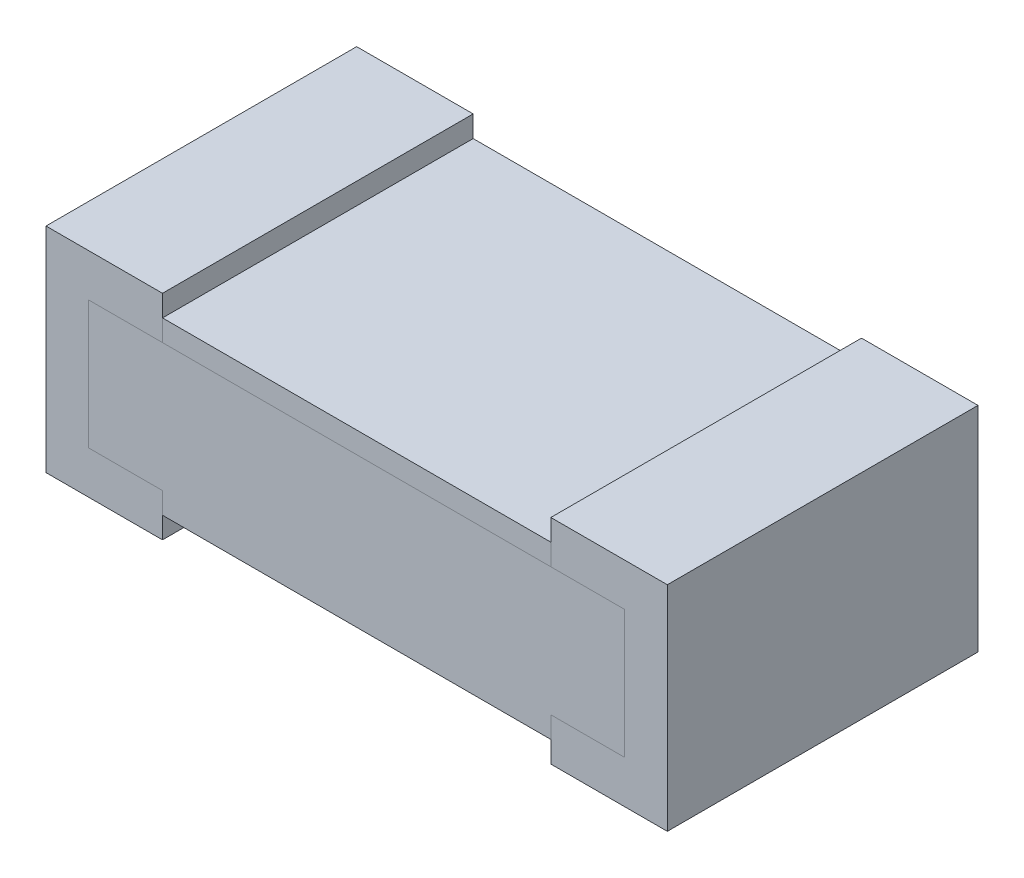
ISO-10303-21;
HEADER;
FILE_DESCRIPTION(('STEP AP214'),'2;1');
FILE_NAME('part.step','',(''),(''),'','','');
FILE_SCHEMA(('AUTOMOTIVE_DESIGN { 1 0 10303 214 1 1 1 1 }'));
ENDSEC;
DATA;
#1=APPLICATION_CONTEXT('core data for automotive mechanical design processes');
#2=APPLICATION_PROTOCOL_DEFINITION('international standard','automotive_design',2000,#1);
#3=PRODUCT_CONTEXT('',#1,'mechanical');
#4=PRODUCT('Part','Part','',(#3));
#5=PRODUCT_RELATED_PRODUCT_CATEGORY('part','',(#4));
#6=PRODUCT_DEFINITION_FORMATION('','',#4);
#7=PRODUCT_DEFINITION_CONTEXT('part definition',#1,'design');
#8=PRODUCT_DEFINITION('design','',#6,#7);
#9=PRODUCT_DEFINITION_SHAPE('','',#8);
#10=(LENGTH_UNIT() NAMED_UNIT(*) SI_UNIT(.MILLI.,.METRE.));
#11=(NAMED_UNIT(*) PLANE_ANGLE_UNIT() SI_UNIT($,.RADIAN.));
#12=(NAMED_UNIT(*) SI_UNIT($,.STERADIAN.) SOLID_ANGLE_UNIT());
#13=UNCERTAINTY_MEASURE_WITH_UNIT(LENGTH_MEASURE(1.E-05),#10,'distance_accuracy_value','');
#14=(GEOMETRIC_REPRESENTATION_CONTEXT(3) GLOBAL_UNCERTAINTY_ASSIGNED_CONTEXT((#13)) GLOBAL_UNIT_ASSIGNED_CONTEXT((#10,
#11,#12)) REPRESENTATION_CONTEXT('',''));
#15=CARTESIAN_POINT('',(0.,0.,0.));
#16=DIRECTION('',(0.,0.,1.));
#17=DIRECTION('',(1.,0.,0.));
#18=AXIS2_PLACEMENT_3D('',#15,#16,#17);
#19=CARTESIAN_POINT('',(0.,0.,-0.4));
#20=DIRECTION('',(0.,0.,-1.));
#21=DIRECTION('',(0.,-1.,0.));
#22=AXIS2_PLACEMENT_3D('',#19,#20,#21);
#23=PLANE('',#22);
#24=DIRECTION('',(0.,-1.,0.));
#25=VECTOR('',#24,1.);
#26=CARTESIAN_POINT('',(-0.8,0.,-0.4));
#27=LINE('',#26,#25);
#28=CARTESIAN_POINT('',(-0.8,0.55,-0.4));
#29=VERTEX_POINT('',#28);
#30=CARTESIAN_POINT('',(-0.8,0.,-0.4));
#31=VERTEX_POINT('',#30);
#32=EDGE_CURVE('P0_E133',#29,#31,#27,.T.);
#33=ORIENTED_EDGE('',*,*,#32,.F.);
#34=DIRECTION('',(-1.,0.,0.));
#35=VECTOR('',#34,1.);
#36=CARTESIAN_POINT('',(-0.8,0.55,-0.4));
#37=LINE('',#36,#35);
#38=CARTESIAN_POINT('',(-0.5,0.55,-0.4));
#39=VERTEX_POINT('',#38);
#40=EDGE_CURVE('P0_E20',#39,#29,#37,.T.);
#41=ORIENTED_EDGE('',*,*,#40,.F.);
#42=DIRECTION('',(0.,1.,0.));
#43=VECTOR('',#42,1.);
#44=CARTESIAN_POINT('',(-0.5,0.55,-0.4));
#45=LINE('',#44,#43);
#46=CARTESIAN_POINT('',(-0.5,0.44,-0.4));
#47=VERTEX_POINT('',#46);
#48=EDGE_CURVE('P0_E151',#47,#39,#45,.T.);
#49=ORIENTED_EDGE('',*,*,#48,.F.);
#50=DIRECTION('',(1.,0.,0.));
#51=VECTOR('',#50,1.);
#52=CARTESIAN_POINT('',(-0.5,0.44,-0.4));
#53=LINE('',#52,#51);
#54=CARTESIAN_POINT('',(-0.69,0.44,-0.4));
#55=VERTEX_POINT('',#54);
#56=EDGE_CURVE('P0_E87',#55,#47,#53,.T.);
#57=ORIENTED_EDGE('',*,*,#56,.F.);
#58=DIRECTION('',(0.,1.,0.));
#59=VECTOR('',#58,1.);
#60=CARTESIAN_POINT('',(-0.69,0.44,-0.4));
#61=LINE('',#60,#59);
#62=CARTESIAN_POINT('',(-0.69,0.11,-0.4));
#63=VERTEX_POINT('',#62);
#64=EDGE_CURVE('P0_E184',#63,#55,#61,.T.);
#65=ORIENTED_EDGE('',*,*,#64,.F.);
#66=DIRECTION('',(-1.,0.,0.));
#67=VECTOR('',#66,1.);
#68=CARTESIAN_POINT('',(-0.69,0.11,-0.4));
#69=LINE('',#68,#67);
#70=CARTESIAN_POINT('',(-0.5,0.11,-0.4));
#71=VERTEX_POINT('',#70);
#72=EDGE_CURVE('P0_E137',#71,#63,#69,.T.);
#73=ORIENTED_EDGE('',*,*,#72,.F.);
#74=DIRECTION('',(0.,1.,0.));
#75=VECTOR('',#74,1.);
#76=CARTESIAN_POINT('',(-0.5,0.11,-0.4));
#77=LINE('',#76,#75);
#78=CARTESIAN_POINT('',(-0.5,0.,-0.4));
#79=VERTEX_POINT('',#78);
#80=EDGE_CURVE('P0_E142',#79,#71,#77,.T.);
#81=ORIENTED_EDGE('',*,*,#80,.F.);
#82=DIRECTION('',(1.,0.,0.));
#83=VECTOR('',#82,1.);
#84=CARTESIAN_POINT('',(-0.5,0.,-0.4));
#85=LINE('',#84,#83);
#86=EDGE_CURVE('P0_E122',#31,#79,#85,.T.);
#87=ORIENTED_EDGE('',*,*,#86,.F.);
#88=EDGE_LOOP('',(#33,#41,#49,#57,#65,#73,#81,#87));
#89=FACE_BOUND('',#88,.T.);
#90=ADVANCED_FACE('P0_F16',(#89),#23,.T.);
#91=CARTESIAN_POINT('',(0.,0.,0.4));
#92=DIRECTION('',(0.,0.,-1.));
#93=DIRECTION('',(0.,-1.,0.));
#94=AXIS2_PLACEMENT_3D('',#91,#92,#93);
#95=PLANE('',#94);
#96=DIRECTION('',(0.,-1.,0.));
#97=VECTOR('',#96,1.);
#98=CARTESIAN_POINT('',(-0.8,0.,0.4));
#99=LINE('',#98,#97);
#100=CARTESIAN_POINT('',(-0.8,0.55,0.4));
#101=VERTEX_POINT('',#100);
#102=CARTESIAN_POINT('',(-0.8,0.,0.4));
#103=VERTEX_POINT('',#102);
#104=EDGE_CURVE('P0_E109',#101,#103,#99,.T.);
#105=ORIENTED_EDGE('',*,*,#104,.T.);
#106=DIRECTION('',(1.,0.,0.));
#107=VECTOR('',#106,1.);
#108=CARTESIAN_POINT('',(-0.5,0.,0.4));
#109=LINE('',#108,#107);
#110=CARTESIAN_POINT('',(-0.5,0.,0.4));
#111=VERTEX_POINT('',#110);
#112=EDGE_CURVE('P0_E147',#103,#111,#109,.T.);
#113=ORIENTED_EDGE('',*,*,#112,.T.);
#114=DIRECTION('',(0.,1.,0.));
#115=VECTOR('',#114,1.);
#116=CARTESIAN_POINT('',(-0.5,0.11,0.4));
#117=LINE('',#116,#115);
#118=CARTESIAN_POINT('',(-0.5,0.11,0.4));
#119=VERTEX_POINT('',#118);
#120=EDGE_CURVE('P0_E173',#111,#119,#117,.T.);
#121=ORIENTED_EDGE('',*,*,#120,.T.);
#122=DIRECTION('',(-1.,0.,0.));
#123=VECTOR('',#122,1.);
#124=CARTESIAN_POINT('',(-0.69,0.11,0.4));
#125=LINE('',#124,#123);
#126=CARTESIAN_POINT('',(-0.69,0.11,0.4));
#127=VERTEX_POINT('',#126);
#128=EDGE_CURVE('P0_E141',#119,#127,#125,.T.);
#129=ORIENTED_EDGE('',*,*,#128,.T.);
#130=DIRECTION('',(0.,1.,0.));
#131=VECTOR('',#130,1.);
#132=CARTESIAN_POINT('',(-0.69,0.44,0.4));
#133=LINE('',#132,#131);
#134=CARTESIAN_POINT('',(-0.69,0.44,0.4));
#135=VERTEX_POINT('',#134);
#136=EDGE_CURVE('P0_E100',#127,#135,#133,.T.);
#137=ORIENTED_EDGE('',*,*,#136,.T.);
#138=DIRECTION('',(1.,0.,0.));
#139=VECTOR('',#138,1.);
#140=CARTESIAN_POINT('',(-0.5,0.44,0.4));
#141=LINE('',#140,#139);
#142=CARTESIAN_POINT('',(-0.5,0.44,0.4));
#143=VERTEX_POINT('',#142);
#144=EDGE_CURVE('P0_E148',#135,#143,#141,.T.);
#145=ORIENTED_EDGE('',*,*,#144,.T.);
#146=DIRECTION('',(0.,1.,0.));
#147=VECTOR('',#146,1.);
#148=CARTESIAN_POINT('',(-0.5,0.55,0.4));
#149=LINE('',#148,#147);
#150=CARTESIAN_POINT('',(-0.5,0.55,0.4));
#151=VERTEX_POINT('',#150);
#152=EDGE_CURVE('P0_E113',#143,#151,#149,.T.);
#153=ORIENTED_EDGE('',*,*,#152,.T.);
#154=DIRECTION('',(-1.,0.,0.));
#155=VECTOR('',#154,1.);
#156=CARTESIAN_POINT('',(-0.8,0.55,0.4));
#157=LINE('',#156,#155);
#158=EDGE_CURVE('P0_E11',#151,#101,#157,.T.);
#159=ORIENTED_EDGE('',*,*,#158,.T.);
#160=EDGE_LOOP('',(#105,#113,#121,#129,#137,#145,#153,#159));
#161=FACE_BOUND('',#160,.T.);
#162=ADVANCED_FACE('P0_F106',(#161),#95,.F.);
#163=CARTESIAN_POINT('',(-0.8,0.55,0.4));
#164=DIRECTION('',(0.,-1.,0.));
#165=DIRECTION('',(0.,0.,-1.));
#166=AXIS2_PLACEMENT_3D('',#163,#164,#165);
#167=PLANE('',#166);
#168=ORIENTED_EDGE('',*,*,#40,.T.);
#169=DIRECTION('',(0.,0.,-1.));
#170=VECTOR('',#169,1.);
#171=CARTESIAN_POINT('',(-0.8,0.55,0.4));
#172=LINE('',#171,#170);
#173=EDGE_CURVE('P0_E116',#101,#29,#172,.T.);
#174=ORIENTED_EDGE('',*,*,#173,.F.);
#175=ORIENTED_EDGE('',*,*,#158,.F.);
#176=DIRECTION('',(0.,0.,-1.));
#177=VECTOR('',#176,1.);
#178=CARTESIAN_POINT('',(-0.5,0.55,0.4));
#179=LINE('',#178,#177);
#180=EDGE_CURVE('P0_E158',#151,#39,#179,.T.);
#181=ORIENTED_EDGE('',*,*,#180,.T.);
#182=EDGE_LOOP('',(#168,#174,#175,#181));
#183=FACE_BOUND('',#182,.T.);
#184=ADVANCED_FACE('P0_F117',(#183),#167,.F.);
#185=CARTESIAN_POINT('',(-0.5,0.55,0.4));
#186=DIRECTION('',(-1.,0.,0.));
#187=DIRECTION('',(0.,0.,1.));
#188=AXIS2_PLACEMENT_3D('',#185,#186,#187);
#189=PLANE('',#188);
#190=ORIENTED_EDGE('',*,*,#48,.T.);
#191=ORIENTED_EDGE('',*,*,#180,.F.);
#192=ORIENTED_EDGE('',*,*,#152,.F.);
#193=DIRECTION('',(0.,0.,-1.));
#194=VECTOR('',#193,1.);
#195=CARTESIAN_POINT('',(-0.5,0.44,0.4));
#196=LINE('',#195,#194);
#197=EDGE_CURVE('P0_E152',#143,#47,#196,.T.);
#198=ORIENTED_EDGE('',*,*,#197,.T.);
#199=EDGE_LOOP('',(#190,#191,#192,#198));
#200=FACE_BOUND('',#199,.T.);
#201=ADVANCED_FACE('P0_F221',(#200),#189,.F.);
#202=CARTESIAN_POINT('',(-0.5,0.44,0.4));
#203=DIRECTION('',(0.,1.,0.));
#204=DIRECTION('',(1.,0.,0.));
#205=AXIS2_PLACEMENT_3D('',#202,#203,#204);
#206=PLANE('',#205);
#207=ORIENTED_EDGE('',*,*,#56,.T.);
#208=ORIENTED_EDGE('',*,*,#197,.F.);
#209=ORIENTED_EDGE('',*,*,#144,.F.);
#210=DIRECTION('',(0.,0.,-1.));
#211=VECTOR('',#210,1.);
#212=CARTESIAN_POINT('',(-0.69,0.44,0.4));
#213=LINE('',#212,#211);
#214=EDGE_CURVE('P0_E171',#135,#55,#213,.T.);
#215=ORIENTED_EDGE('',*,*,#214,.T.);
#216=EDGE_LOOP('',(#207,#208,#209,#215));
#217=FACE_BOUND('',#216,.T.);
#218=ADVANCED_FACE('P0_F18',(#217),#206,.F.);
#219=CARTESIAN_POINT('',(-0.69,0.44,0.4));
#220=DIRECTION('',(-1.,0.,0.));
#221=DIRECTION('',(0.,0.,1.));
#222=AXIS2_PLACEMENT_3D('',#219,#220,#221);
#223=PLANE('',#222);
#224=ORIENTED_EDGE('',*,*,#64,.T.);
#225=ORIENTED_EDGE('',*,*,#214,.F.);
#226=ORIENTED_EDGE('',*,*,#136,.F.);
#227=DIRECTION('',(0.,0.,-1.));
#228=VECTOR('',#227,1.);
#229=CARTESIAN_POINT('',(-0.69,0.11,0.4));
#230=LINE('',#229,#228);
#231=EDGE_CURVE('P0_E138',#127,#63,#230,.T.);
#232=ORIENTED_EDGE('',*,*,#231,.T.);
#233=EDGE_LOOP('',(#224,#225,#226,#232));
#234=FACE_BOUND('',#233,.T.);
#235=ADVANCED_FACE('P0_F220',(#234),#223,.F.);
#236=CARTESIAN_POINT('',(-0.69,0.11,0.4));
#237=DIRECTION('',(0.,-1.,0.));
#238=DIRECTION('',(0.,0.,-1.));
#239=AXIS2_PLACEMENT_3D('',#236,#237,#238);
#240=PLANE('',#239);
#241=ORIENTED_EDGE('',*,*,#72,.T.);
#242=ORIENTED_EDGE('',*,*,#231,.F.);
#243=ORIENTED_EDGE('',*,*,#128,.F.);
#244=DIRECTION('',(0.,0.,-1.));
#245=VECTOR('',#244,1.);
#246=CARTESIAN_POINT('',(-0.5,0.11,0.4));
#247=LINE('',#246,#245);
#248=EDGE_CURVE('P0_E146',#119,#71,#247,.T.);
#249=ORIENTED_EDGE('',*,*,#248,.T.);
#250=EDGE_LOOP('',(#241,#242,#243,#249));
#251=FACE_BOUND('',#250,.T.);
#252=ADVANCED_FACE('P0_F230',(#251),#240,.F.);
#253=CARTESIAN_POINT('',(-0.5,0.11,0.4));
#254=DIRECTION('',(-1.,0.,0.));
#255=DIRECTION('',(0.,0.,1.));
#256=AXIS2_PLACEMENT_3D('',#253,#254,#255);
#257=PLANE('',#256);
#258=ORIENTED_EDGE('',*,*,#80,.T.);
#259=ORIENTED_EDGE('',*,*,#248,.F.);
#260=ORIENTED_EDGE('',*,*,#120,.F.);
#261=DIRECTION('',(0.,0.,-1.));
#262=VECTOR('',#261,1.);
#263=CARTESIAN_POINT('',(-0.5,0.,0.4));
#264=LINE('',#263,#262);
#265=EDGE_CURVE('P0_E155',#111,#79,#264,.T.);
#266=ORIENTED_EDGE('',*,*,#265,.T.);
#267=EDGE_LOOP('',(#258,#259,#260,#266));
#268=FACE_BOUND('',#267,.T.);
#269=ADVANCED_FACE('P0_F207',(#268),#257,.F.);
#270=CARTESIAN_POINT('',(-0.5,0.,0.4));
#271=DIRECTION('',(0.,1.,0.));
#272=DIRECTION('',(1.,0.,0.));
#273=AXIS2_PLACEMENT_3D('',#270,#271,#272);
#274=PLANE('',#273);
#275=ORIENTED_EDGE('',*,*,#86,.T.);
#276=ORIENTED_EDGE('',*,*,#265,.F.);
#277=ORIENTED_EDGE('',*,*,#112,.F.);
#278=DIRECTION('',(0.,0.,-1.));
#279=VECTOR('',#278,1.);
#280=CARTESIAN_POINT('',(-0.8,0.,0.4));
#281=LINE('',#280,#279);
#282=EDGE_CURVE('P0_E126',#103,#31,#281,.T.);
#283=ORIENTED_EDGE('',*,*,#282,.T.);
#284=EDGE_LOOP('',(#275,#276,#277,#283));
#285=FACE_BOUND('',#284,.T.);
#286=ADVANCED_FACE('P0_F211',(#285),#274,.F.);
#287=CARTESIAN_POINT('',(-0.8,0.,0.4));
#288=DIRECTION('',(1.,0.,0.));
#289=DIRECTION('',(0.,1.,0.));
#290=AXIS2_PLACEMENT_3D('',#287,#288,#289);
#291=PLANE('',#290);
#292=ORIENTED_EDGE('',*,*,#32,.T.);
#293=ORIENTED_EDGE('',*,*,#282,.F.);
#294=ORIENTED_EDGE('',*,*,#104,.F.);
#295=ORIENTED_EDGE('',*,*,#173,.T.);
#296=EDGE_LOOP('',(#292,#293,#294,#295));
#297=FACE_BOUND('',#296,.T.);
#298=ADVANCED_FACE('P0_F124',(#297),#291,.F.);
#299=CLOSED_SHELL('',(#90,#162,#184,#201,#218,#235,#252,#269,#286,#298));
#300=MANIFOLD_SOLID_BREP('P0_B1',#299);
#301=CARTESIAN_POINT('',(0.,0.,-0.4));
#302=DIRECTION('',(0.,0.,1.));
#303=DIRECTION('',(1.,0.,0.));
#304=AXIS2_PLACEMENT_3D('',#301,#302,#303);
#305=PLANE('',#304);
#306=DIRECTION('',(-1.,0.,0.));
#307=VECTOR('',#306,1.);
#308=CARTESIAN_POINT('',(0.69,0.11,-0.4));
#309=LINE('',#308,#307);
#310=CARTESIAN_POINT('',(0.69,0.11,-0.4));
#311=VERTEX_POINT('',#310);
#312=CARTESIAN_POINT('',(0.5,0.11,-0.4));
#313=VERTEX_POINT('',#312);
#314=EDGE_CURVE('P1_E115',#311,#313,#309,.T.);
#315=ORIENTED_EDGE('',*,*,#314,.F.);
#316=DIRECTION('',(0.,-1.,0.));
#317=VECTOR('',#316,1.);
#318=CARTESIAN_POINT('',(0.69,0.44,-0.4));
#319=LINE('',#318,#317);
#320=CARTESIAN_POINT('',(0.69,0.44,-0.4));
#321=VERTEX_POINT('',#320);
#322=EDGE_CURVE('P1_E26',#321,#311,#319,.T.);
#323=ORIENTED_EDGE('',*,*,#322,.F.);
#324=DIRECTION('',(1.,0.,0.));
#325=VECTOR('',#324,1.);
#326=CARTESIAN_POINT('',(0.5,0.44,-0.4));
#327=LINE('',#326,#325);
#328=CARTESIAN_POINT('',(0.5,0.44,-0.4));
#329=VERTEX_POINT('',#328);
#330=EDGE_CURVE('P1_E170',#329,#321,#327,.T.);
#331=ORIENTED_EDGE('',*,*,#330,.F.);
#332=DIRECTION('',(0.,-1.,0.));
#333=VECTOR('',#332,1.);
#334=CARTESIAN_POINT('',(0.5,0.55,-0.4));
#335=LINE('',#334,#333);
#336=CARTESIAN_POINT('',(0.5,0.55,-0.4));
#337=VERTEX_POINT('',#336);
#338=EDGE_CURVE('P1_E136',#337,#329,#335,.T.);
#339=ORIENTED_EDGE('',*,*,#338,.F.);
#340=DIRECTION('',(-1.,0.,0.));
#341=VECTOR('',#340,1.);
#342=CARTESIAN_POINT('',(0.8,0.55,-0.4));
#343=LINE('',#342,#341);
#344=CARTESIAN_POINT('',(0.8,0.55,-0.4));
#345=VERTEX_POINT('',#344);
#346=EDGE_CURVE('P1_E138',#345,#337,#343,.T.);
#347=ORIENTED_EDGE('',*,*,#346,.F.);
#348=DIRECTION('',(0.,1.,0.));
#349=VECTOR('',#348,1.);
#350=CARTESIAN_POINT('',(0.8,0.,-0.4));
#351=LINE('',#350,#349);
#352=CARTESIAN_POINT('',(0.8,0.,-0.4));
#353=VERTEX_POINT('',#352);
#354=EDGE_CURVE('P1_E125',#353,#345,#351,.T.);
#355=ORIENTED_EDGE('',*,*,#354,.F.);
#356=DIRECTION('',(1.,0.,0.));
#357=VECTOR('',#356,1.);
#358=CARTESIAN_POINT('',(0.5,0.,-0.4));
#359=LINE('',#358,#357);
#360=CARTESIAN_POINT('',(0.5,0.,-0.4));
#361=VERTEX_POINT('',#360);
#362=EDGE_CURVE('P1_E132',#361,#353,#359,.T.);
#363=ORIENTED_EDGE('',*,*,#362,.F.);
#364=DIRECTION('',(0.,-1.,0.));
#365=VECTOR('',#364,1.);
#366=CARTESIAN_POINT('',(0.5,0.11,-0.4));
#367=LINE('',#366,#365);
#368=EDGE_CURVE('P1_E104',#313,#361,#367,.T.);
#369=ORIENTED_EDGE('',*,*,#368,.F.);
#370=EDGE_LOOP('',(#315,#323,#331,#339,#347,#355,#363,#369));
#371=FACE_BOUND('',#370,.T.);
#372=ADVANCED_FACE('P1_F16',(#371),#305,.F.);
#373=CARTESIAN_POINT('',(0.,0.,0.4));
#374=DIRECTION('',(0.,0.,1.));
#375=DIRECTION('',(1.,0.,0.));
#376=AXIS2_PLACEMENT_3D('',#373,#374,#375);
#377=PLANE('',#376);
#378=DIRECTION('',(-1.,0.,0.));
#379=VECTOR('',#378,1.);
#380=CARTESIAN_POINT('',(0.69,0.11,0.4));
#381=LINE('',#380,#379);
#382=CARTESIAN_POINT('',(0.69,0.11,0.4));
#383=VERTEX_POINT('',#382);
#384=CARTESIAN_POINT('',(0.5,0.11,0.4));
#385=VERTEX_POINT('',#384);
#386=EDGE_CURVE('P1_E91',#383,#385,#381,.T.);
#387=ORIENTED_EDGE('',*,*,#386,.T.);
#388=DIRECTION('',(0.,-1.,0.));
#389=VECTOR('',#388,1.);
#390=CARTESIAN_POINT('',(0.5,0.11,0.4));
#391=LINE('',#390,#389);
#392=CARTESIAN_POINT('',(0.5,0.,0.4));
#393=VERTEX_POINT('',#392);
#394=EDGE_CURVE('P1_E119',#385,#393,#391,.T.);
#395=ORIENTED_EDGE('',*,*,#394,.T.);
#396=DIRECTION('',(1.,0.,0.));
#397=VECTOR('',#396,1.);
#398=CARTESIAN_POINT('',(0.5,0.,0.4));
#399=LINE('',#398,#397);
#400=CARTESIAN_POINT('',(0.8,0.,0.4));
#401=VERTEX_POINT('',#400);
#402=EDGE_CURVE('P1_E131',#393,#401,#399,.T.);
#403=ORIENTED_EDGE('',*,*,#402,.T.);
#404=DIRECTION('',(0.,1.,0.));
#405=VECTOR('',#404,1.);
#406=CARTESIAN_POINT('',(0.8,0.,0.4));
#407=LINE('',#406,#405);
#408=CARTESIAN_POINT('',(0.8,0.55,0.4));
#409=VERTEX_POINT('',#408);
#410=EDGE_CURVE('P1_E124',#401,#409,#407,.T.);
#411=ORIENTED_EDGE('',*,*,#410,.T.);
#412=DIRECTION('',(-1.,0.,0.));
#413=VECTOR('',#412,1.);
#414=CARTESIAN_POINT('',(0.8,0.55,0.4));
#415=LINE('',#414,#413);
#416=CARTESIAN_POINT('',(0.5,0.55,0.4));
#417=VERTEX_POINT('',#416);
#418=EDGE_CURVE('P1_E133',#409,#417,#415,.T.);
#419=ORIENTED_EDGE('',*,*,#418,.T.);
#420=DIRECTION('',(0.,-1.,0.));
#421=VECTOR('',#420,1.);
#422=CARTESIAN_POINT('',(0.5,0.55,0.4));
#423=LINE('',#422,#421);
#424=CARTESIAN_POINT('',(0.5,0.44,0.4));
#425=VERTEX_POINT('',#424);
#426=EDGE_CURVE('P1_E158',#417,#425,#423,.T.);
#427=ORIENTED_EDGE('',*,*,#426,.T.);
#428=DIRECTION('',(1.,0.,0.));
#429=VECTOR('',#428,1.);
#430=CARTESIAN_POINT('',(0.5,0.44,0.4));
#431=LINE('',#430,#429);
#432=CARTESIAN_POINT('',(0.69,0.44,0.4));
#433=VERTEX_POINT('',#432);
#434=EDGE_CURVE('P1_E94',#425,#433,#431,.T.);
#435=ORIENTED_EDGE('',*,*,#434,.T.);
#436=DIRECTION('',(0.,-1.,0.));
#437=VECTOR('',#436,1.);
#438=CARTESIAN_POINT('',(0.69,0.44,0.4));
#439=LINE('',#438,#437);
#440=EDGE_CURVE('P1_E11',#433,#383,#439,.T.);
#441=ORIENTED_EDGE('',*,*,#440,.T.);
#442=EDGE_LOOP('',(#387,#395,#403,#411,#419,#427,#435,#441));
#443=FACE_BOUND('',#442,.T.);
#444=ADVANCED_FACE('P1_F88',(#443),#377,.T.);
#445=CARTESIAN_POINT('',(0.69,0.44,0.4));
#446=DIRECTION('',(1.,0.,0.));
#447=DIRECTION('',(0.,1.,0.));
#448=AXIS2_PLACEMENT_3D('',#445,#446,#447);
#449=PLANE('',#448);
#450=ORIENTED_EDGE('',*,*,#322,.T.);
#451=DIRECTION('',(0.,0.,-1.));
#452=VECTOR('',#451,1.);
#453=CARTESIAN_POINT('',(0.69,0.11,0.4));
#454=LINE('',#453,#452);
#455=EDGE_CURVE('P1_E98',#383,#311,#454,.T.);
#456=ORIENTED_EDGE('',*,*,#455,.F.);
#457=ORIENTED_EDGE('',*,*,#440,.F.);
#458=DIRECTION('',(0.,0.,-1.));
#459=VECTOR('',#458,1.);
#460=CARTESIAN_POINT('',(0.69,0.44,0.4));
#461=LINE('',#460,#459);
#462=EDGE_CURVE('P1_E167',#433,#321,#461,.T.);
#463=ORIENTED_EDGE('',*,*,#462,.T.);
#464=EDGE_LOOP('',(#450,#456,#457,#463));
#465=FACE_BOUND('',#464,.T.);
#466=ADVANCED_FACE('P1_F99',(#465),#449,.F.);
#467=CARTESIAN_POINT('',(0.5,0.44,0.4));
#468=DIRECTION('',(0.,1.,0.));
#469=DIRECTION('',(1.,0.,0.));
#470=AXIS2_PLACEMENT_3D('',#467,#468,#469);
#471=PLANE('',#470);
#472=ORIENTED_EDGE('',*,*,#330,.T.);
#473=ORIENTED_EDGE('',*,*,#462,.F.);
#474=ORIENTED_EDGE('',*,*,#434,.F.);
#475=DIRECTION('',(0.,0.,-1.));
#476=VECTOR('',#475,1.);
#477=CARTESIAN_POINT('',(0.5,0.44,0.4));
#478=LINE('',#477,#476);
#479=EDGE_CURVE('P1_E211',#425,#329,#478,.T.);
#480=ORIENTED_EDGE('',*,*,#479,.T.);
#481=EDGE_LOOP('',(#472,#473,#474,#480));
#482=FACE_BOUND('',#481,.T.);
#483=ADVANCED_FACE('P1_F334',(#482),#471,.F.);
#484=CARTESIAN_POINT('',(0.5,0.55,0.4));
#485=DIRECTION('',(1.,0.,0.));
#486=DIRECTION('',(0.,1.,0.));
#487=AXIS2_PLACEMENT_3D('',#484,#485,#486);
#488=PLANE('',#487);
#489=ORIENTED_EDGE('',*,*,#338,.T.);
#490=ORIENTED_EDGE('',*,*,#479,.F.);
#491=ORIENTED_EDGE('',*,*,#426,.F.);
#492=DIRECTION('',(0.,0.,-1.));
#493=VECTOR('',#492,1.);
#494=CARTESIAN_POINT('',(0.5,0.55,0.4));
#495=LINE('',#494,#493);
#496=EDGE_CURVE('P1_E137',#417,#337,#495,.T.);
#497=ORIENTED_EDGE('',*,*,#496,.T.);
#498=EDGE_LOOP('',(#489,#490,#491,#497));
#499=FACE_BOUND('',#498,.T.);
#500=ADVANCED_FACE('P1_F209',(#499),#488,.F.);
#501=CARTESIAN_POINT('',(0.8,0.55,0.4));
#502=DIRECTION('',(0.,-1.,0.));
#503=DIRECTION('',(0.,0.,-1.));
#504=AXIS2_PLACEMENT_3D('',#501,#502,#503);
#505=PLANE('',#504);
#506=ORIENTED_EDGE('',*,*,#346,.T.);
#507=ORIENTED_EDGE('',*,*,#496,.F.);
#508=ORIENTED_EDGE('',*,*,#418,.F.);
#509=DIRECTION('',(0.,0.,-1.));
#510=VECTOR('',#509,1.);
#511=CARTESIAN_POINT('',(0.8,0.55,0.4));
#512=LINE('',#511,#510);
#513=EDGE_CURVE('P1_E121',#409,#345,#512,.T.);
#514=ORIENTED_EDGE('',*,*,#513,.T.);
#515=EDGE_LOOP('',(#506,#507,#508,#514));
#516=FACE_BOUND('',#515,.T.);
#517=ADVANCED_FACE('P1_F18',(#516),#505,.F.);
#518=CARTESIAN_POINT('',(0.8,0.,0.4));
#519=DIRECTION('',(-1.,0.,0.));
#520=DIRECTION('',(0.,1.,0.));
#521=AXIS2_PLACEMENT_3D('',#518,#519,#520);
#522=PLANE('',#521);
#523=ORIENTED_EDGE('',*,*,#354,.T.);
#524=ORIENTED_EDGE('',*,*,#513,.F.);
#525=ORIENTED_EDGE('',*,*,#410,.F.);
#526=DIRECTION('',(0.,0.,-1.));
#527=VECTOR('',#526,1.);
#528=CARTESIAN_POINT('',(0.8,0.,0.4));
#529=LINE('',#528,#527);
#530=EDGE_CURVE('P1_E127',#401,#353,#529,.T.);
#531=ORIENTED_EDGE('',*,*,#530,.T.);
#532=EDGE_LOOP('',(#523,#524,#525,#531));
#533=FACE_BOUND('',#532,.T.);
#534=ADVANCED_FACE('P1_F198',(#533),#522,.F.);
#535=CARTESIAN_POINT('',(0.5,0.,0.4));
#536=DIRECTION('',(0.,1.,0.));
#537=DIRECTION('',(1.,0.,0.));
#538=AXIS2_PLACEMENT_3D('',#535,#536,#537);
#539=PLANE('',#538);
#540=ORIENTED_EDGE('',*,*,#362,.T.);
#541=ORIENTED_EDGE('',*,*,#530,.F.);
#542=ORIENTED_EDGE('',*,*,#402,.F.);
#543=DIRECTION('',(0.,0.,-1.));
#544=VECTOR('',#543,1.);
#545=CARTESIAN_POINT('',(0.5,0.,0.4));
#546=LINE('',#545,#544);
#547=EDGE_CURVE('P1_E163',#393,#361,#546,.T.);
#548=ORIENTED_EDGE('',*,*,#547,.T.);
#549=EDGE_LOOP('',(#540,#541,#542,#548));
#550=FACE_BOUND('',#549,.T.);
#551=ADVANCED_FACE('P1_F196',(#550),#539,.F.);
#552=CARTESIAN_POINT('',(0.5,0.11,0.4));
#553=DIRECTION('',(1.,0.,0.));
#554=DIRECTION('',(0.,1.,0.));
#555=AXIS2_PLACEMENT_3D('',#552,#553,#554);
#556=PLANE('',#555);
#557=ORIENTED_EDGE('',*,*,#368,.T.);
#558=ORIENTED_EDGE('',*,*,#547,.F.);
#559=ORIENTED_EDGE('',*,*,#394,.F.);
#560=DIRECTION('',(0.,0.,-1.));
#561=VECTOR('',#560,1.);
#562=CARTESIAN_POINT('',(0.5,0.11,0.4));
#563=LINE('',#562,#561);
#564=EDGE_CURVE('P1_E108',#385,#313,#563,.T.);
#565=ORIENTED_EDGE('',*,*,#564,.T.);
#566=EDGE_LOOP('',(#557,#558,#559,#565));
#567=FACE_BOUND('',#566,.T.);
#568=ADVANCED_FACE('P1_F195',(#567),#556,.F.);
#569=CARTESIAN_POINT('',(0.69,0.11,0.4));
#570=DIRECTION('',(0.,-1.,0.));
#571=DIRECTION('',(0.,0.,-1.));
#572=AXIS2_PLACEMENT_3D('',#569,#570,#571);
#573=PLANE('',#572);
#574=ORIENTED_EDGE('',*,*,#314,.T.);
#575=ORIENTED_EDGE('',*,*,#564,.F.);
#576=ORIENTED_EDGE('',*,*,#386,.F.);
#577=ORIENTED_EDGE('',*,*,#455,.T.);
#578=EDGE_LOOP('',(#574,#575,#576,#577));
#579=FACE_BOUND('',#578,.T.);
#580=ADVANCED_FACE('P1_F106',(#579),#573,.F.);
#581=CLOSED_SHELL('',(#372,#444,#466,#483,#500,#517,#534,#551,#568,#580));
#582=MANIFOLD_SOLID_BREP('P1_B1',#581);
#583=CARTESIAN_POINT('',(0.,0.,-0.4));
#584=DIRECTION('',(0.,0.,1.));
#585=DIRECTION('',(1.,0.,0.));
#586=AXIS2_PLACEMENT_3D('',#583,#584,#585);
#587=PLANE('',#586);
#588=DIRECTION('',(0.,-1.,0.));
#589=VECTOR('',#588,1.);
#590=CARTESIAN_POINT('',(-0.69,0.44,-0.4));
#591=LINE('',#590,#589);
#592=CARTESIAN_POINT('',(-0.69,0.44,-0.4));
#593=VERTEX_POINT('',#592);
#594=CARTESIAN_POINT('',(-0.69,0.11,-0.4));
#595=VERTEX_POINT('',#594);
#596=EDGE_CURVE('P2_E119',#593,#595,#591,.T.);
#597=ORIENTED_EDGE('',*,*,#596,.F.);
#598=DIRECTION('',(-1.,0.,0.));
#599=VECTOR('',#598,1.);
#600=CARTESIAN_POINT('',(-0.69,0.44,-0.4));
#601=LINE('',#600,#599);
#602=CARTESIAN_POINT('',(0.69,0.44,-0.4));
#603=VERTEX_POINT('',#602);
#604=EDGE_CURVE('P2_E27',#603,#593,#601,.T.);
#605=ORIENTED_EDGE('',*,*,#604,.F.);
#606=DIRECTION('',(0.,1.,0.));
#607=VECTOR('',#606,1.);
#608=CARTESIAN_POINT('',(0.69,0.44,-0.4));
#609=LINE('',#608,#607);
#610=CARTESIAN_POINT('',(0.69,0.11,-0.4));
#611=VERTEX_POINT('',#610);
#612=EDGE_CURVE('P2_E173',#611,#603,#609,.T.);
#613=ORIENTED_EDGE('',*,*,#612,.F.);
#614=DIRECTION('',(1.,0.,0.));
#615=VECTOR('',#614,1.);
#616=CARTESIAN_POINT('',(0.5,0.11,-0.4));
#617=LINE('',#616,#615);
#618=CARTESIAN_POINT('',(0.5,0.11,-0.4));
#619=VERTEX_POINT('',#618);
#620=EDGE_CURVE('P2_E155',#619,#611,#617,.T.);
#621=ORIENTED_EDGE('',*,*,#620,.F.);
#622=DIRECTION('',(0.,1.,0.));
#623=VECTOR('',#622,1.);
#624=CARTESIAN_POINT('',(0.5,0.11,-0.4));
#625=LINE('',#624,#623);
#626=CARTESIAN_POINT('',(0.5,0.055,-0.4));
#627=VERTEX_POINT('',#626);
#628=EDGE_CURVE('P2_E86',#627,#619,#625,.T.);
#629=ORIENTED_EDGE('',*,*,#628,.F.);
#630=DIRECTION('',(1.,0.,0.));
#631=VECTOR('',#630,1.);
#632=CARTESIAN_POINT('',(-0.5,0.055,-0.4));
#633=LINE('',#632,#631);
#634=CARTESIAN_POINT('',(-0.5,0.055,-0.4));
#635=VERTEX_POINT('',#634);
#636=EDGE_CURVE('P2_E148',#635,#627,#633,.T.);
#637=ORIENTED_EDGE('',*,*,#636,.F.);
#638=DIRECTION('',(0.,-1.,0.));
#639=VECTOR('',#638,1.);
#640=CARTESIAN_POINT('',(-0.5,0.11,-0.4));
#641=LINE('',#640,#639);
#642=CARTESIAN_POINT('',(-0.5,0.11,-0.4));
#643=VERTEX_POINT('',#642);
#644=EDGE_CURVE('P2_E121',#643,#635,#641,.T.);
#645=ORIENTED_EDGE('',*,*,#644,.F.);
#646=DIRECTION('',(1.,0.,0.));
#647=VECTOR('',#646,1.);
#648=CARTESIAN_POINT('',(-0.69,0.11,-0.4));
#649=LINE('',#648,#647);
#650=EDGE_CURVE('P2_E117',#595,#643,#649,.T.);
#651=ORIENTED_EDGE('',*,*,#650,.F.);
#652=EDGE_LOOP('',(#597,#605,#613,#621,#629,#637,#645,#651));
#653=FACE_BOUND('',#652,.T.);
#654=ADVANCED_FACE('P2_F17',(#653),#587,.F.);
#655=CARTESIAN_POINT('',(0.,0.,0.4));
#656=DIRECTION('',(0.,0.,1.));
#657=DIRECTION('',(1.,0.,0.));
#658=AXIS2_PLACEMENT_3D('',#655,#656,#657);
#659=PLANE('',#658);
#660=DIRECTION('',(0.,-1.,0.));
#661=VECTOR('',#660,1.);
#662=CARTESIAN_POINT('',(-0.69,0.44,0.4));
#663=LINE('',#662,#661);
#664=CARTESIAN_POINT('',(-0.69,0.44,0.4));
#665=VERTEX_POINT('',#664);
#666=CARTESIAN_POINT('',(-0.69,0.11,0.4));
#667=VERTEX_POINT('',#666);
#668=EDGE_CURVE('P2_E132',#665,#667,#663,.T.);
#669=ORIENTED_EDGE('',*,*,#668,.T.);
#670=DIRECTION('',(1.,0.,0.));
#671=VECTOR('',#670,1.);
#672=CARTESIAN_POINT('',(-0.69,0.11,0.4));
#673=LINE('',#672,#671);
#674=CARTESIAN_POINT('',(-0.5,0.11,0.4));
#675=VERTEX_POINT('',#674);
#676=EDGE_CURVE('P2_E109',#667,#675,#673,.T.);
#677=ORIENTED_EDGE('',*,*,#676,.T.);
#678=DIRECTION('',(0.,-1.,0.));
#679=VECTOR('',#678,1.);
#680=CARTESIAN_POINT('',(-0.5,0.11,0.4));
#681=LINE('',#680,#679);
#682=CARTESIAN_POINT('',(-0.5,0.055,0.4));
#683=VERTEX_POINT('',#682);
#684=EDGE_CURVE('P2_E160',#675,#683,#681,.T.);
#685=ORIENTED_EDGE('',*,*,#684,.T.);
#686=DIRECTION('',(1.,0.,0.));
#687=VECTOR('',#686,1.);
#688=CARTESIAN_POINT('',(-0.5,0.055,0.4));
#689=LINE('',#688,#687);
#690=CARTESIAN_POINT('',(0.5,0.055,0.4));
#691=VERTEX_POINT('',#690);
#692=EDGE_CURVE('P2_E98',#683,#691,#689,.T.);
#693=ORIENTED_EDGE('',*,*,#692,.T.);
#694=DIRECTION('',(0.,1.,0.));
#695=VECTOR('',#694,1.);
#696=CARTESIAN_POINT('',(0.5,0.11,0.4));
#697=LINE('',#696,#695);
#698=CARTESIAN_POINT('',(0.5,0.11,0.4));
#699=VERTEX_POINT('',#698);
#700=EDGE_CURVE('P2_E151',#691,#699,#697,.T.);
#701=ORIENTED_EDGE('',*,*,#700,.T.);
#702=DIRECTION('',(1.,0.,0.));
#703=VECTOR('',#702,1.);
#704=CARTESIAN_POINT('',(0.5,0.11,0.4));
#705=LINE('',#704,#703);
#706=CARTESIAN_POINT('',(0.69,0.11,0.4));
#707=VERTEX_POINT('',#706);
#708=EDGE_CURVE('P2_E168',#699,#707,#705,.T.);
#709=ORIENTED_EDGE('',*,*,#708,.T.);
#710=DIRECTION('',(0.,1.,0.));
#711=VECTOR('',#710,1.);
#712=CARTESIAN_POINT('',(0.69,0.44,0.4));
#713=LINE('',#712,#711);
#714=CARTESIAN_POINT('',(0.69,0.44,0.4));
#715=VERTEX_POINT('',#714);
#716=EDGE_CURVE('P2_E172',#707,#715,#713,.T.);
#717=ORIENTED_EDGE('',*,*,#716,.T.);
#718=DIRECTION('',(-1.,0.,0.));
#719=VECTOR('',#718,1.);
#720=CARTESIAN_POINT('',(-0.69,0.44,0.4));
#721=LINE('',#720,#719);
#722=EDGE_CURVE('P2_E11',#715,#665,#721,.T.);
#723=ORIENTED_EDGE('',*,*,#722,.T.);
#724=EDGE_LOOP('',(#669,#677,#685,#693,#701,#709,#717,#723));
#725=FACE_BOUND('',#724,.T.);
#726=ADVANCED_FACE('P2_F349',(#725),#659,.T.);
#727=CARTESIAN_POINT('',(-0.69,0.44,0.4));
#728=DIRECTION('',(0.,-1.,0.));
#729=DIRECTION('',(0.,0.,-1.));
#730=AXIS2_PLACEMENT_3D('',#727,#728,#729);
#731=PLANE('',#730);
#732=ORIENTED_EDGE('',*,*,#604,.T.);
#733=DIRECTION('',(0.,0.,-1.));
#734=VECTOR('',#733,1.);
#735=CARTESIAN_POINT('',(-0.69,0.44,0.4));
#736=LINE('',#735,#734);
#737=EDGE_CURVE('P2_E125',#665,#593,#736,.T.);
#738=ORIENTED_EDGE('',*,*,#737,.F.);
#739=ORIENTED_EDGE('',*,*,#722,.F.);
#740=DIRECTION('',(0.,0.,-1.));
#741=VECTOR('',#740,1.);
#742=CARTESIAN_POINT('',(0.69,0.44,0.4));
#743=LINE('',#742,#741);
#744=EDGE_CURVE('P2_E169',#715,#603,#743,.T.);
#745=ORIENTED_EDGE('',*,*,#744,.T.);
#746=EDGE_LOOP('',(#732,#738,#739,#745));
#747=FACE_BOUND('',#746,.T.);
#748=ADVANCED_FACE('P2_F340',(#747),#731,.F.);
#749=CARTESIAN_POINT('',(0.69,0.44,0.4));
#750=DIRECTION('',(-1.,0.,0.));
#751=DIRECTION('',(0.,0.,1.));
#752=AXIS2_PLACEMENT_3D('',#749,#750,#751);
#753=PLANE('',#752);
#754=ORIENTED_EDGE('',*,*,#612,.T.);
#755=ORIENTED_EDGE('',*,*,#744,.F.);
#756=ORIENTED_EDGE('',*,*,#716,.F.);
#757=DIRECTION('',(0.,0.,-1.));
#758=VECTOR('',#757,1.);
#759=CARTESIAN_POINT('',(0.69,0.11,0.4));
#760=LINE('',#759,#758);
#761=EDGE_CURVE('P2_E164',#707,#611,#760,.T.);
#762=ORIENTED_EDGE('',*,*,#761,.T.);
#763=EDGE_LOOP('',(#754,#755,#756,#762));
#764=FACE_BOUND('',#763,.T.);
#765=ADVANCED_FACE('P2_F329',(#764),#753,.F.);
#766=CARTESIAN_POINT('',(0.5,0.11,0.4));
#767=DIRECTION('',(0.,1.,0.));
#768=DIRECTION('',(1.,0.,0.));
#769=AXIS2_PLACEMENT_3D('',#766,#767,#768);
#770=PLANE('',#769);
#771=ORIENTED_EDGE('',*,*,#620,.T.);
#772=ORIENTED_EDGE('',*,*,#761,.F.);
#773=ORIENTED_EDGE('',*,*,#708,.F.);
#774=DIRECTION('',(0.,0.,-1.));
#775=VECTOR('',#774,1.);
#776=CARTESIAN_POINT('',(0.5,0.11,0.4));
#777=LINE('',#776,#775);
#778=EDGE_CURVE('P2_E156',#699,#619,#777,.T.);
#779=ORIENTED_EDGE('',*,*,#778,.T.);
#780=EDGE_LOOP('',(#771,#772,#773,#779));
#781=FACE_BOUND('',#780,.T.);
#782=ADVANCED_FACE('P2_F318',(#781),#770,.F.);
#783=CARTESIAN_POINT('',(0.5,0.11,0.4));
#784=DIRECTION('',(-1.,0.,0.));
#785=DIRECTION('',(0.,0.,1.));
#786=AXIS2_PLACEMENT_3D('',#783,#784,#785);
#787=PLANE('',#786);
#788=ORIENTED_EDGE('',*,*,#628,.T.);
#789=ORIENTED_EDGE('',*,*,#778,.F.);
#790=ORIENTED_EDGE('',*,*,#700,.F.);
#791=DIRECTION('',(0.,0.,-1.));
#792=VECTOR('',#791,1.);
#793=CARTESIAN_POINT('',(0.5,0.055,0.4));
#794=LINE('',#793,#792);
#795=EDGE_CURVE('P2_E145',#691,#627,#794,.T.);
#796=ORIENTED_EDGE('',*,*,#795,.T.);
#797=EDGE_LOOP('',(#788,#789,#790,#796));
#798=FACE_BOUND('',#797,.T.);
#799=ADVANCED_FACE('P2_F308',(#798),#787,.F.);
#800=CARTESIAN_POINT('',(-0.5,0.055,0.4));
#801=DIRECTION('',(0.,1.,0.));
#802=DIRECTION('',(1.,0.,0.));
#803=AXIS2_PLACEMENT_3D('',#800,#801,#802);
#804=PLANE('',#803);
#805=ORIENTED_EDGE('',*,*,#636,.T.);
#806=ORIENTED_EDGE('',*,*,#795,.F.);
#807=ORIENTED_EDGE('',*,*,#692,.F.);
#808=DIRECTION('',(0.,0.,-1.));
#809=VECTOR('',#808,1.);
#810=CARTESIAN_POINT('',(-0.5,0.055,0.4));
#811=LINE('',#810,#809);
#812=EDGE_CURVE('P2_E163',#683,#635,#811,.T.);
#813=ORIENTED_EDGE('',*,*,#812,.T.);
#814=EDGE_LOOP('',(#805,#806,#807,#813));
#815=FACE_BOUND('',#814,.T.);
#816=ADVANCED_FACE('P2_F296',(#815),#804,.F.);
#817=CARTESIAN_POINT('',(-0.5,0.11,0.4));
#818=DIRECTION('',(1.,0.,0.));
#819=DIRECTION('',(0.,1.,0.));
#820=AXIS2_PLACEMENT_3D('',#817,#818,#819);
#821=PLANE('',#820);
#822=ORIENTED_EDGE('',*,*,#644,.T.);
#823=ORIENTED_EDGE('',*,*,#812,.F.);
#824=ORIENTED_EDGE('',*,*,#684,.F.);
#825=DIRECTION('',(0.,0.,-1.));
#826=VECTOR('',#825,1.);
#827=CARTESIAN_POINT('',(-0.5,0.11,0.4));
#828=LINE('',#827,#826);
#829=EDGE_CURVE('P2_E124',#675,#643,#828,.T.);
#830=ORIENTED_EDGE('',*,*,#829,.T.);
#831=EDGE_LOOP('',(#822,#823,#824,#830));
#832=FACE_BOUND('',#831,.T.);
#833=ADVANCED_FACE('P2_F286',(#832),#821,.F.);
#834=CARTESIAN_POINT('',(-0.69,0.11,0.4));
#835=DIRECTION('',(0.,1.,0.));
#836=DIRECTION('',(1.,0.,0.));
#837=AXIS2_PLACEMENT_3D('',#834,#835,#836);
#838=PLANE('',#837);
#839=ORIENTED_EDGE('',*,*,#650,.T.);
#840=ORIENTED_EDGE('',*,*,#829,.F.);
#841=ORIENTED_EDGE('',*,*,#676,.F.);
#842=DIRECTION('',(0.,0.,-1.));
#843=VECTOR('',#842,1.);
#844=CARTESIAN_POINT('',(-0.69,0.11,0.4));
#845=LINE('',#844,#843);
#846=EDGE_CURVE('P2_E128',#667,#595,#845,.T.);
#847=ORIENTED_EDGE('',*,*,#846,.T.);
#848=EDGE_LOOP('',(#839,#840,#841,#847));
#849=FACE_BOUND('',#848,.T.);
#850=ADVANCED_FACE('P2_F19',(#849),#838,.F.);
#851=CARTESIAN_POINT('',(-0.69,0.44,0.4));
#852=DIRECTION('',(1.,0.,0.));
#853=DIRECTION('',(0.,1.,0.));
#854=AXIS2_PLACEMENT_3D('',#851,#852,#853);
#855=PLANE('',#854);
#856=ORIENTED_EDGE('',*,*,#596,.T.);
#857=ORIENTED_EDGE('',*,*,#846,.F.);
#858=ORIENTED_EDGE('',*,*,#668,.F.);
#859=ORIENTED_EDGE('',*,*,#737,.T.);
#860=EDGE_LOOP('',(#856,#857,#858,#859));
#861=FACE_BOUND('',#860,.T.);
#862=ADVANCED_FACE('P2_F135',(#861),#855,.F.);
#863=CLOSED_SHELL('',(#654,#726,#748,#765,#782,#799,#816,#833,#850,#862));
#864=MANIFOLD_SOLID_BREP('P2_B1',#863);
#865=CARTESIAN_POINT('',(0.,0.,0.4));
#866=DIRECTION('',(0.,0.,1.));
#867=DIRECTION('',(1.,0.,0.));
#868=AXIS2_PLACEMENT_3D('',#865,#866,#867);
#869=PLANE('',#868);
#870=DIRECTION('',(0.,1.,0.));
#871=VECTOR('',#870,1.);
#872=CARTESIAN_POINT('',(0.5,0.44,0.4));
#873=LINE('',#872,#871);
#874=CARTESIAN_POINT('',(0.5,0.44,0.4));
#875=VERTEX_POINT('',#874);
#876=CARTESIAN_POINT('',(0.5,0.495,0.4));
#877=VERTEX_POINT('',#876);
#878=EDGE_CURVE('P3_E90',#875,#877,#873,.T.);
#879=ORIENTED_EDGE('',*,*,#878,.T.);
#880=DIRECTION('',(-1.,0.,0.));
#881=VECTOR('',#880,1.);
#882=CARTESIAN_POINT('',(0.5,0.495,0.4));
#883=LINE('',#882,#881);
#884=CARTESIAN_POINT('',(-0.5,0.495,0.4));
#885=VERTEX_POINT('',#884);
#886=EDGE_CURVE('P3_E28',#877,#885,#883,.T.);
#887=ORIENTED_EDGE('',*,*,#886,.T.);
#888=DIRECTION('',(0.,-1.,0.));
#889=VECTOR('',#888,1.);
#890=CARTESIAN_POINT('',(-0.5,0.44,0.4));
#891=LINE('',#890,#889);
#892=CARTESIAN_POINT('',(-0.5,0.44,0.4));
#893=VERTEX_POINT('',#892);
#894=EDGE_CURVE('P3_E78',#885,#893,#891,.T.);
#895=ORIENTED_EDGE('',*,*,#894,.T.);
#896=DIRECTION('',(1.,0.,0.));
#897=VECTOR('',#896,1.);
#898=CARTESIAN_POINT('',(0.5,0.44,0.4));
#899=LINE('',#898,#897);
#900=EDGE_CURVE('P3_E102',#893,#875,#899,.T.);
#901=ORIENTED_EDGE('',*,*,#900,.T.);
#902=EDGE_LOOP('',(#879,#887,#895,#901));
#903=FACE_BOUND('',#902,.T.);
#904=ADVANCED_FACE('P3_F17',(#903),#869,.T.);
#905=CARTESIAN_POINT('',(0.,0.,-0.4));
#906=DIRECTION('',(0.,0.,1.));
#907=DIRECTION('',(1.,0.,0.));
#908=AXIS2_PLACEMENT_3D('',#905,#906,#907);
#909=PLANE('',#908);
#910=DIRECTION('',(0.,1.,0.));
#911=VECTOR('',#910,1.);
#912=CARTESIAN_POINT('',(0.5,0.44,-0.4));
#913=LINE('',#912,#911);
#914=CARTESIAN_POINT('',(0.5,0.44,-0.4));
#915=VERTEX_POINT('',#914);
#916=CARTESIAN_POINT('',(0.5,0.495,-0.4));
#917=VERTEX_POINT('',#916);
#918=EDGE_CURVE('P3_E81',#915,#917,#913,.T.);
#919=ORIENTED_EDGE('',*,*,#918,.F.);
#920=DIRECTION('',(1.,0.,0.));
#921=VECTOR('',#920,1.);
#922=CARTESIAN_POINT('',(0.5,0.44,-0.4));
#923=LINE('',#922,#921);
#924=CARTESIAN_POINT('',(-0.5,0.44,-0.4));
#925=VERTEX_POINT('',#924);
#926=EDGE_CURVE('P3_E71',#925,#915,#923,.T.);
#927=ORIENTED_EDGE('',*,*,#926,.F.);
#928=DIRECTION('',(0.,-1.,0.));
#929=VECTOR('',#928,1.);
#930=CARTESIAN_POINT('',(-0.5,0.44,-0.4));
#931=LINE('',#930,#929);
#932=CARTESIAN_POINT('',(-0.5,0.495,-0.4));
#933=VERTEX_POINT('',#932);
#934=EDGE_CURVE('P3_E105',#933,#925,#931,.T.);
#935=ORIENTED_EDGE('',*,*,#934,.F.);
#936=DIRECTION('',(-1.,0.,0.));
#937=VECTOR('',#936,1.);
#938=CARTESIAN_POINT('',(0.5,0.495,-0.4));
#939=LINE('',#938,#937);
#940=EDGE_CURVE('P3_E11',#917,#933,#939,.T.);
#941=ORIENTED_EDGE('',*,*,#940,.F.);
#942=EDGE_LOOP('',(#919,#927,#935,#941));
#943=FACE_BOUND('',#942,.T.);
#944=ADVANCED_FACE('P3_F82',(#943),#909,.F.);
#945=CARTESIAN_POINT('',(0.5,0.495,-0.4));
#946=DIRECTION('',(0.,1.,0.));
#947=DIRECTION('',(1.,0.,0.));
#948=AXIS2_PLACEMENT_3D('',#945,#946,#947);
#949=PLANE('',#948);
#950=ORIENTED_EDGE('',*,*,#886,.F.);
#951=DIRECTION('',(0.,0.,1.));
#952=VECTOR('',#951,1.);
#953=CARTESIAN_POINT('',(0.5,0.495,-0.4));
#954=LINE('',#953,#952);
#955=EDGE_CURVE('P3_E86',#917,#877,#954,.T.);
#956=ORIENTED_EDGE('',*,*,#955,.F.);
#957=ORIENTED_EDGE('',*,*,#940,.T.);
#958=DIRECTION('',(0.,0.,1.));
#959=VECTOR('',#958,1.);
#960=CARTESIAN_POINT('',(-0.5,0.495,-0.4));
#961=LINE('',#960,#959);
#962=EDGE_CURVE('P3_E103',#933,#885,#961,.T.);
#963=ORIENTED_EDGE('',*,*,#962,.T.);
#964=EDGE_LOOP('',(#950,#956,#957,#963));
#965=FACE_BOUND('',#964,.T.);
#966=ADVANCED_FACE('P3_F121',(#965),#949,.T.);
#967=CARTESIAN_POINT('',(-0.5,0.44,-0.4));
#968=DIRECTION('',(-1.,0.,0.));
#969=DIRECTION('',(0.,0.,1.));
#970=AXIS2_PLACEMENT_3D('',#967,#968,#969);
#971=PLANE('',#970);
#972=ORIENTED_EDGE('',*,*,#894,.F.);
#973=ORIENTED_EDGE('',*,*,#962,.F.);
#974=ORIENTED_EDGE('',*,*,#934,.T.);
#975=DIRECTION('',(0.,0.,1.));
#976=VECTOR('',#975,1.);
#977=CARTESIAN_POINT('',(-0.5,0.44,-0.4));
#978=LINE('',#977,#976);
#979=EDGE_CURVE('P3_E76',#925,#893,#978,.T.);
#980=ORIENTED_EDGE('',*,*,#979,.T.);
#981=EDGE_LOOP('',(#972,#973,#974,#980));
#982=FACE_BOUND('',#981,.T.);
#983=ADVANCED_FACE('P3_F123',(#982),#971,.T.);
#984=CARTESIAN_POINT('',(0.5,0.44,-0.4));
#985=DIRECTION('',(0.,-1.,0.));
#986=DIRECTION('',(0.,0.,-1.));
#987=AXIS2_PLACEMENT_3D('',#984,#985,#986);
#988=PLANE('',#987);
#989=ORIENTED_EDGE('',*,*,#900,.F.);
#990=ORIENTED_EDGE('',*,*,#979,.F.);
#991=ORIENTED_EDGE('',*,*,#926,.T.);
#992=DIRECTION('',(0.,0.,1.));
#993=VECTOR('',#992,1.);
#994=CARTESIAN_POINT('',(0.5,0.44,-0.4));
#995=LINE('',#994,#993);
#996=EDGE_CURVE('P3_E21',#915,#875,#995,.T.);
#997=ORIENTED_EDGE('',*,*,#996,.T.);
#998=EDGE_LOOP('',(#989,#990,#991,#997));
#999=FACE_BOUND('',#998,.T.);
#1000=ADVANCED_FACE('P3_F19',(#999),#988,.T.);
#1001=CARTESIAN_POINT('',(0.5,0.44,-0.4));
#1002=DIRECTION('',(1.,0.,0.));
#1003=DIRECTION('',(0.,1.,0.));
#1004=AXIS2_PLACEMENT_3D('',#1001,#1002,#1003);
#1005=PLANE('',#1004);
#1006=ORIENTED_EDGE('',*,*,#878,.F.);
#1007=ORIENTED_EDGE('',*,*,#996,.F.);
#1008=ORIENTED_EDGE('',*,*,#918,.T.);
#1009=ORIENTED_EDGE('',*,*,#955,.T.);
#1010=EDGE_LOOP('',(#1006,#1007,#1008,#1009));
#1011=FACE_BOUND('',#1010,.T.);
#1012=ADVANCED_FACE('P3_F88',(#1011),#1005,.T.);
#1013=CLOSED_SHELL('',(#904,#944,#966,#983,#1000,#1012));
#1014=MANIFOLD_SOLID_BREP('P3_B1',#1013);
#1015=ADVANCED_BREP_SHAPE_REPRESENTATION('',(#18,#300,#582,#864,#1014),#14);
#1016=SHAPE_DEFINITION_REPRESENTATION(#9,#1015);
ENDSEC;
END-ISO-10303-21;
